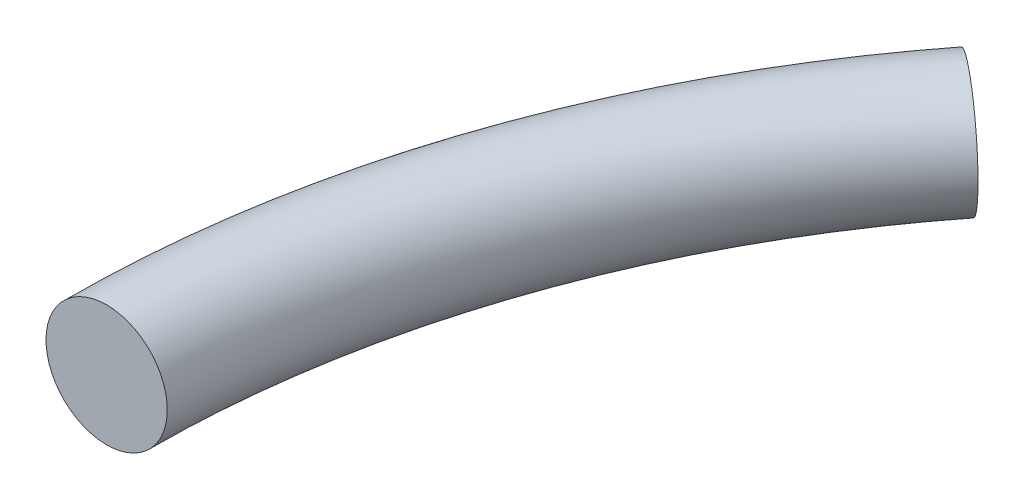
ISO-10303-21;
HEADER;
FILE_DESCRIPTION(('STEP AP214'),'2;1');
FILE_NAME('part.step','',(''),(''),'','','');
FILE_SCHEMA(('AUTOMOTIVE_DESIGN { 1 0 10303 214 1 1 1 1 }'));
ENDSEC;
DATA;
#1=APPLICATION_CONTEXT('core data for automotive mechanical design processes');
#2=APPLICATION_PROTOCOL_DEFINITION('international standard','automotive_design',2000,#1);
#3=PRODUCT_CONTEXT('',#1,'mechanical');
#4=PRODUCT('Part','Part','',(#3));
#5=PRODUCT_RELATED_PRODUCT_CATEGORY('part','',(#4));
#6=PRODUCT_DEFINITION_FORMATION('','',#4);
#7=PRODUCT_DEFINITION_CONTEXT('part definition',#1,'design');
#8=PRODUCT_DEFINITION('design','',#6,#7);
#9=PRODUCT_DEFINITION_SHAPE('','',#8);
#10=(LENGTH_UNIT() NAMED_UNIT(*) SI_UNIT(.MILLI.,.METRE.));
#11=(NAMED_UNIT(*) PLANE_ANGLE_UNIT() SI_UNIT($,.RADIAN.));
#12=(NAMED_UNIT(*) SI_UNIT($,.STERADIAN.) SOLID_ANGLE_UNIT());
#13=UNCERTAINTY_MEASURE_WITH_UNIT(LENGTH_MEASURE(1.E-05),#10,'distance_accuracy_value','');
#14=(GEOMETRIC_REPRESENTATION_CONTEXT(3) GLOBAL_UNCERTAINTY_ASSIGNED_CONTEXT((#13)) GLOBAL_UNIT_ASSIGNED_CONTEXT((#10,
#11,#12)) REPRESENTATION_CONTEXT('',''));
#15=CARTESIAN_POINT('',(0.,0.,0.));
#16=DIRECTION('',(0.,0.,1.));
#17=DIRECTION('',(1.,0.,0.));
#18=AXIS2_PLACEMENT_3D('',#15,#16,#17);
#19=CARTESIAN_POINT('',(0.,6.,0.));
#20=DIRECTION('',(0.,0.,1.));
#21=DIRECTION('',(1.,0.,0.));
#22=AXIS2_PLACEMENT_3D('',#19,#20,#21);
#23=PLANE('',#22);
#24=CARTESIAN_POINT('',(-7.262175820468,0.7302,0.));
#25=CARTESIAN_POINT('',(-7.2621739747897,0.75265524155964,0.));
#26=CARTESIAN_POINT('',(-7.2602779728223,0.775130857259379,0.));
#27=CARTESIAN_POINT('',(-7.25273506158998,0.819482451297505,0.));
#28=CARTESIAN_POINT('',(-7.24708012453793,0.841357041711003,0.));
#29=CARTESIAN_POINT('',(-7.23218781535238,0.883809618347233,0.));
#30=CARTESIAN_POINT('',(-7.222956837236,0.904389843003349,0.));
#31=CARTESIAN_POINT('',(-7.2011573598692,0.943737337222425,0.));
#32=CARTESIAN_POINT('',(-7.18858412597164,0.962501982989582,0.));
#33=CARTESIAN_POINT('',(-7.16048381854081,0.99762748493817,0.));
#34=CARTESIAN_POINT('',(-7.14496093510355,1.01399169330263,0.));
#35=CARTESIAN_POINT('',(-7.11136611881257,1.0439048849067,0.));
#36=CARTESIAN_POINT('',(-7.0932906479613,1.05744989503907,0.));
#37=CARTESIAN_POINT('',(-7.0551350261555,1.08130194187445,0.));
#38=CARTESIAN_POINT('',(-7.03505634491774,1.0916113298001,0.));
#39=CARTESIAN_POINT('',(-6.99345195198375,1.10871348302438,0.));
#40=CARTESIAN_POINT('',(-6.9719261552418,1.11550604143746,0.));
#41=CARTESIAN_POINT('',(-6.92804035509872,1.12538061292917,0.));
#42=CARTESIAN_POINT('',(-6.90568037624903,1.12846273512374,0.));
#43=CARTESIAN_POINT('',(-6.86076034127671,1.1308293161772,0.));
#44=CARTESIAN_POINT('',(-6.83820028515408,1.13011377503607,0.));
#45=CARTESIAN_POINT('',(-6.79351984273579,1.12490525493437,0.));
#46=CARTESIAN_POINT('',(-6.77139946939009,1.12041216488209,0.));
#47=CARTESIAN_POINT('',(-6.7282283521706,1.10777635092602,0.));
#48=CARTESIAN_POINT('',(-6.70717754546078,1.09963384169881,0.));
#49=CARTESIAN_POINT('',(-6.66672684895851,1.07992311451522,0.));
#50=CARTESIAN_POINT('',(-6.64732817368728,1.06835240391896,0.));
#51=CARTESIAN_POINT('',(-6.61077614780736,1.04213485030234,0.));
#52=CARTESIAN_POINT('',(-6.59361969626921,1.02749233015651,0.));
#53=CARTESIAN_POINT('',(-6.56198406840621,0.995513974748309,0.));
#54=CARTESIAN_POINT('',(-6.54750870674424,0.97817436557765,0.));
#55=CARTESIAN_POINT('',(-6.52169539400023,0.941335318357767,0.));
#56=CARTESIAN_POINT('',(-6.51035301018211,0.921838987081608,0.));
#57=CARTESIAN_POINT('',(-6.49108235554042,0.881186262625342,0.));
#58=CARTESIAN_POINT('',(-6.4831602081295,0.8600269715397,0.));
#59=CARTESIAN_POINT('',(-6.47099872287023,0.81671349003598,0.));
#60=CARTESIAN_POINT('',(-6.46675154751478,0.794561523394871,0.));
#61=CARTESIAN_POINT('',(-6.46291387481202,0.758269762147004,0.));
#62=CARTESIAN_POINT('',(-6.4621746665626,0.744238862857464,0.));
#63=CARTESIAN_POINT('',(-6.4621776661463,0.70774475844036,0.));
#64=CARTESIAN_POINT('',(-6.46407366811369,0.685269142740621,0.));
#65=CARTESIAN_POINT('',(-6.47161657934602,0.640917548702496,0.));
#66=CARTESIAN_POINT('',(-6.47727151639807,0.619042958288997,0.));
#67=CARTESIAN_POINT('',(-6.49216382558362,0.576590381652767,0.));
#68=CARTESIAN_POINT('',(-6.5013948037,0.556010156996651,0.));
#69=CARTESIAN_POINT('',(-6.5231942810668,0.516662662777575,0.));
#70=CARTESIAN_POINT('',(-6.53576751496436,0.497898017010418,0.));
#71=CARTESIAN_POINT('',(-6.56386782239519,0.46277251506183,0.));
#72=CARTESIAN_POINT('',(-6.57939070583245,0.44640830669737,0.));
#73=CARTESIAN_POINT('',(-6.61298552212343,0.416495115093301,0.));
#74=CARTESIAN_POINT('',(-6.6310609929747,0.40295010496093,0.));
#75=CARTESIAN_POINT('',(-6.6692166147805,0.379098058125552,0.));
#76=CARTESIAN_POINT('',(-6.68929529601826,0.368788670199895,0.));
#77=CARTESIAN_POINT('',(-6.73089968895225,0.351686516975622,0.));
#78=CARTESIAN_POINT('',(-6.7524254856942,0.344893958562538,0.));
#79=CARTESIAN_POINT('',(-6.79631128583728,0.335019387070832,0.));
#80=CARTESIAN_POINT('',(-6.81867126468697,0.331937264876257,0.));
#81=CARTESIAN_POINT('',(-6.86359129965929,0.329570683822803,0.));
#82=CARTESIAN_POINT('',(-6.88615135578192,0.330286224963925,0.));
#83=CARTESIAN_POINT('',(-6.93083179820021,0.335494745065634,0.));
#84=CARTESIAN_POINT('',(-6.95295217154591,0.339987835117909,0.));
#85=CARTESIAN_POINT('',(-6.9961232887654,0.352623649073977,0.));
#86=CARTESIAN_POINT('',(-7.01717409547522,0.360766158301187,0.));
#87=CARTESIAN_POINT('',(-7.05762479197749,0.380476885484782,0.));
#88=CARTESIAN_POINT('',(-7.07702346724872,0.392047596081044,0.));
#89=CARTESIAN_POINT('',(-7.11357549312864,0.418265149697663,0.));
#90=CARTESIAN_POINT('',(-7.13073194466679,0.432907669843493,0.));
#91=CARTESIAN_POINT('',(-7.16236757252979,0.464886025251691,0.));
#92=CARTESIAN_POINT('',(-7.17684293419176,0.48222563442235,0.));
#93=CARTESIAN_POINT('',(-7.20265624693577,0.519064681642233,0.));
#94=CARTESIAN_POINT('',(-7.21399863075389,0.538561012918392,0.));
#95=CARTESIAN_POINT('',(-7.23326928539558,0.579213737374657,0.));
#96=CARTESIAN_POINT('',(-7.24119143280649,0.6003730284603,0.));
#97=CARTESIAN_POINT('',(-7.25335291806577,0.64368650996402,0.));
#98=CARTESIAN_POINT('',(-7.25760009342122,0.665838476605129,0.));
#99=CARTESIAN_POINT('',(-7.26143776612397,0.702130237852995,0.));
#100=CARTESIAN_POINT('',(-7.2621769743734,0.716161137142536,0.));
#101=CARTESIAN_POINT('',(-7.262175820468,0.7302,0.));
#102=B_SPLINE_CURVE_WITH_KNOTS('',3,(#24,#25,#26,#27,#28,#29,#30,#31,#32,#33,#34,#35,#36,#37,
#38,#39,#40,#41,#42,#43,#44,#45,#46,#47,#48,#49,#50,#51,#52,#53,#54,#55,#56,#57,#58,#59,#60,#61,
#62,#63,#64,#65,#66,#67,#68,#69,#70,#71,#72,#73,#74,#75,#76,#77,#78,#79,#80,#81,#82,#83,#84,#85,
#86,#87,#88,#89,#90,#91,#92,#93,#94,#95,#96,#97,#98,#99,#100,#101),.UNSPECIFIED.,.T.,.F.,(4,2,2,
2,2,2,2,2,2,2,2,2,2,2,2,2,2,2,2,2,2,2,2,2,2,2,2,2,2,2,2,2,2,2,2,2,2,2,4),(0.,0.0673217190940752,
0.134787678055461,0.202133559490899,0.269575356418626,0.336922056232694,0.40436303479347,
0.471754892083668,0.539150713403566,0.606544552708823,0.673938392014078,0.741334213333976,
0.808726070624174,0.876167049184948,0.943513748999019,1.01095554592846,1.07830142736561,
1.14576738632871,1.2130891054245,1.25517818200736,1.32249990110144,1.38996586006282,
1.45731174149826,1.52475353842599,1.59210023824006,1.65954121680083,1.72693307409103,
1.79432889541093,1.86172273471618,1.92911657402144,1.99651239534134,2.06390425263154,
2.13134523119231,2.19869193100638,2.26613372793582,2.33347960937297,2.40094556833608,
2.46826728743186,2.51035636401472),.UNSPECIFIED.);
#103=CARTESIAN_POINT('',(-7.262175820468,0.7302,0.));
#104=VERTEX_POINT('',#103);
#105=EDGE_CURVE('E18',#104,#104,#102,.T.);
#106=ORIENTED_EDGE('',*,*,#105,.F.);
#107=EDGE_LOOP('',(#106));
#108=FACE_BOUND('',#107,.T.);
#109=ADVANCED_FACE('F14',(#108),#23,.T.);
#110=CARTESIAN_POINT('',(0.,6.,0.));
#111=DIRECTION('',(-0.615661475325695,0.,0.788010753606693));
#112=DIRECTION('',(0.788010753606693,0.,0.615661475325695));
#113=AXIS2_PLACEMENT_3D('',#110,#111,#112);
#114=PLANE('',#113);
#115=CARTESIAN_POINT('',(-5.09226403822594,0.7302,-3.97851269944336));
#116=CARTESIAN_POINT('',(-5.09226549264029,0.75265524155964,-3.97851383575639));
#117=CARTESIAN_POINT('',(-5.09375956257946,0.775130857259379,-3.97968113112485));
#118=CARTESIAN_POINT('',(-5.09970345774403,0.819482451297505,-3.9843250109824));
#119=CARTESIAN_POINT('',(-5.10415960895201,0.841357041711003,-3.98780653787074));
#120=CARTESIAN_POINT('',(-5.11589490873626,0.883809618347233,-3.99697515891492));
#121=CARTESIAN_POINT('',(-5.12316901875828,0.904389843003348,-4.00265831652075));
#122=CARTESIAN_POINT('',(-5.14034724134632,0.943737337222425,-4.01607941491772));
#123=CARTESIAN_POINT('',(-5.15025508486521,0.962501982989582,-4.02382027064871));
#124=CARTESIAN_POINT('',(-5.17239842930036,0.997627484938171,-4.04112054737868));
#125=CARTESIAN_POINT('',(-5.1846306283759,1.01399169330263,-4.05067738869697));
#126=CARTESIAN_POINT('',(-5.21110370487863,1.0439048849067,-4.07136042285797));
#127=CARTESIAN_POINT('',(-5.22534737028594,1.05744989503907,-4.08248879390947));
#128=CARTESIAN_POINT('',(-5.25541441057946,1.08130194187445,-4.1059797403224));
#129=CARTESIAN_POINT('',(-5.27123662731306,1.0916113298001,-4.11834141083583));
#130=CARTESIAN_POINT('',(-5.30402133634232,1.10871348302438,-4.1439556327696));
#131=CARTESIAN_POINT('',(-5.32098389565493,1.11550604143746,-4.15720823654932));
#132=CARTESIAN_POINT('',(-5.35556637809831,1.12538061292917,-4.18422703301125));
#133=CARTESIAN_POINT('',(-5.37318628188229,1.12846273512374,-4.1979932105781));
#134=CARTESIAN_POINT('',(-5.40858375249286,1.1308293161772,-4.22564874558084));
#135=CARTESIAN_POINT('',(-5.42636131931947,1.13011377503607,-4.23953810301674));
#136=CARTESIAN_POINT('',(-5.46156998842098,1.12490525493437,-4.26704613011418));
#137=CARTESIAN_POINT('',(-5.47900108049119,1.12041216488209,-4.28066479180295));
#138=CARTESIAN_POINT('',(-5.51302038510536,1.10777635092602,-4.30724358552176));
#139=CARTESIAN_POINT('',(-5.5296086471648,1.09963384169881,-4.32020375623753));
#140=CARTESIAN_POINT('',(-5.56148423099946,1.07992311451522,-4.34510769172406));
#141=CARTESIAN_POINT('',(-5.57677059571892,1.06835240391896,-4.35705070876091));
#142=CARTESIAN_POINT('',(-5.6055739851784,1.04213485030234,-4.37955438294028));
#143=CARTESIAN_POINT('',(-5.6190934534842,1.02749233015651,-4.39011694920562));
#144=CARTESIAN_POINT('',(-5.64402266843734,0.995513974748309,-4.40959378652861));
#145=CARTESIAN_POINT('',(-5.65542940908932,0.97817436557765,-4.41850570904529));
#146=CARTESIAN_POINT('',(-5.67577057711781,0.941335318357767,-4.4343979712523));
#147=CARTESIAN_POINT('',(-5.68470849753803,0.921838987081608,-4.44138104000748));
#148=CARTESIAN_POINT('',(-5.69989398062472,0.881186262625342,-4.45324523967467));
#149=CARTESIAN_POINT('',(-5.70613671797618,0.8600269715397,-4.45812260063743));
#150=CARTESIAN_POINT('',(-5.71572009914031,0.81671349003598,-4.4656099585943));
#151=CARTESIAN_POINT('',(-5.71906691899287,0.794561523394872,-4.46822478083961));
#152=CARTESIAN_POINT('',(-5.72209104635146,0.758269762147005,-4.4705874880776));
#153=CARTESIAN_POINT('',(-5.72267355040116,0.744238862857464,-4.47104259011902));
#154=CARTESIAN_POINT('',(-5.72267118669695,0.70774475844036,-4.47104074339089));
#155=CARTESIAN_POINT('',(-5.72117711675778,0.685269142740621,-4.46987344802242));
#156=CARTESIAN_POINT('',(-5.71523322159321,0.640917548702495,-4.46522956816488));
#157=CARTESIAN_POINT('',(-5.71077707038522,0.619042958288997,-4.46174804127655));
#158=CARTESIAN_POINT('',(-5.69904177060097,0.576590381652767,-4.45257942023236));
#159=CARTESIAN_POINT('',(-5.69176766057896,0.556010156996651,-4.44689626262653));
#160=CARTESIAN_POINT('',(-5.67458943799092,0.516662662777575,-4.43347516422956));
#161=CARTESIAN_POINT('',(-5.66468159447202,0.497898017010418,-4.42573430849857));
#162=CARTESIAN_POINT('',(-5.64253825003687,0.46277251506183,-4.4084340317686));
#163=CARTESIAN_POINT('',(-5.63030605096133,0.44640830669737,-4.39887719045031));
#164=CARTESIAN_POINT('',(-5.6038329744586,0.416495115093301,-4.37819415628931));
#165=CARTESIAN_POINT('',(-5.58958930905129,0.40295010496093,-4.36706578523781));
#166=CARTESIAN_POINT('',(-5.55952226875777,0.379098058125552,-4.34357483882488));
#167=CARTESIAN_POINT('',(-5.54370005202417,0.368788670199896,-4.33121316831144));
#168=CARTESIAN_POINT('',(-5.51091534299492,0.351686516975622,-4.30559894637768));
#169=CARTESIAN_POINT('',(-5.49395278368231,0.344893958562538,-4.29234634259797));
#170=CARTESIAN_POINT('',(-5.45937030123892,0.335019387070832,-4.26532754613603));
#171=CARTESIAN_POINT('',(-5.44175039745495,0.331937264876257,-4.25156136856917));
#172=CARTESIAN_POINT('',(-5.40635292684437,0.329570683822803,-4.22390583356644));
#173=CARTESIAN_POINT('',(-5.38857536001777,0.330286224963925,-4.21001647613055));
#174=CARTESIAN_POINT('',(-5.35336669091626,0.335494745065634,-4.1825084490331));
#175=CARTESIAN_POINT('',(-5.33593559884605,0.339987835117909,-4.16888978734433));
#176=CARTESIAN_POINT('',(-5.30191629423187,0.352623649073976,-4.14231099362552));
#177=CARTESIAN_POINT('',(-5.28532803217244,0.360766158301187,-4.12935082290976));
#178=CARTESIAN_POINT('',(-5.25345244833777,0.380476885484782,-4.10444688742322));
#179=CARTESIAN_POINT('',(-5.23816608361832,0.392047596081044,-4.09250387038637));
#180=CARTESIAN_POINT('',(-5.20936269415883,0.418265149697663,-4.07000019620699));
#181=CARTESIAN_POINT('',(-5.19584322585303,0.432907669843493,-4.05943762994166));
#182=CARTESIAN_POINT('',(-5.17091401089989,0.46488602525169,-4.03996079261868));
#183=CARTESIAN_POINT('',(-5.15950727024792,0.482225634422349,-4.031048870102));
#184=CARTESIAN_POINT('',(-5.13916610221943,0.519064681642232,-4.01515660789497));
#185=CARTESIAN_POINT('',(-5.13022818179921,0.538561012918391,-4.00817353913979));
#186=CARTESIAN_POINT('',(-5.11504269871252,0.579213737374657,-3.9963093394726));
#187=CARTESIAN_POINT('',(-5.10879996136106,0.600373028460299,-3.99143197850985));
#188=CARTESIAN_POINT('',(-5.09921658019692,0.64368650996402,-3.98394462055298));
#189=CARTESIAN_POINT('',(-5.09586976034437,0.665838476605128,-3.98132979830767));
#190=CARTESIAN_POINT('',(-5.09284563298578,0.702130237852995,-3.97896709106968));
#191=CARTESIAN_POINT('',(-5.09226312893607,0.716161137142536,-3.97851198902826));
#192=CARTESIAN_POINT('',(-5.09226403822594,0.7302,-3.97851269944336));
#193=B_SPLINE_CURVE_WITH_KNOTS('',3,(#115,#116,#117,#118,#119,#120,#121,#122,#123,#124,#125,
#126,#127,#128,#129,#130,#131,#132,#133,#134,#135,#136,#137,#138,#139,#140,#141,#142,#143,#144,
#145,#146,#147,#148,#149,#150,#151,#152,#153,#154,#155,#156,#157,#158,#159,#160,#161,#162,#163,
#164,#165,#166,#167,#168,#169,#170,#171,#172,#173,#174,#175,#176,#177,#178,#179,#180,#181,#182,
#183,#184,#185,#186,#187,#188,#189,#190,#191,#192),.UNSPECIFIED.,.T.,.F.,(4,2,2,2,2,2,2,2,2,2,2,
2,2,2,2,2,2,2,2,2,2,2,2,2,2,2,2,2,2,2,2,2,2,2,2,2,2,2,4),(0.,0.0673217190940752,
0.134787678055462,0.2021335594909,0.269575356418626,0.336922056232694,0.404363034793469,
0.471754892083666,0.539150713403566,0.606544552708823,0.673938392014079,0.741334213333977,
0.808726070624175,0.876167049184948,0.943513748999019,1.01095554592846,1.07830142736561,
1.14576738632871,1.2130891054245,1.25517818200736,1.32249990110144,1.38996586006282,
1.45731174149826,1.52475353842599,1.59210023824006,1.65954121680083,1.72693307409103,
1.79432889541093,1.86172273471618,1.92911657402144,1.99651239534134,2.06390425263154,
2.13134523119231,2.19869193100638,2.26613372793582,2.33347960937297,2.40094556833607,
2.46826728743186,2.51035636401472),.UNSPECIFIED.);
#194=CARTESIAN_POINT('',(-5.09226403822594,0.7302,-3.97851269944336));
#195=VERTEX_POINT('',#194);
#196=EDGE_CURVE('E10',#195,#195,#193,.T.);
#197=ORIENTED_EDGE('',*,*,#196,.F.);
#198=EDGE_LOOP('',(#197));
#199=FACE_BOUND('',#198,.T.);
#200=ADVANCED_FACE('F34',(#199),#114,.F.);
#201=CARTESIAN_POINT('',(0.,0.7302,0.));
#202=DIRECTION('',(0.,-1.,0.));
#203=DIRECTION('',(0.,0.,1.));
#204=AXIS2_PLACEMENT_3D('',#201,#202,#203);
#205=TOROIDAL_SURFACE('',#204,6.862175820468,0.4);
#206=ORIENTED_EDGE('',*,*,#196,.T.);
#207=EDGE_LOOP('',(#206));
#208=FACE_BOUND('',#207,.T.);
#209=ORIENTED_EDGE('',*,*,#105,.T.);
#210=EDGE_LOOP('',(#209));
#211=FACE_BOUND('',#210,.T.);
#212=ADVANCED_FACE('F36',(#208,#211),#205,.T.);
#213=CLOSED_SHELL('',(#109,#200,#212));
#214=MANIFOLD_SOLID_BREP('B1',#213);
#215=ADVANCED_BREP_SHAPE_REPRESENTATION('',(#18,#214),#14);
#216=SHAPE_DEFINITION_REPRESENTATION(#9,#215);
ENDSEC;
END-ISO-10303-21;
